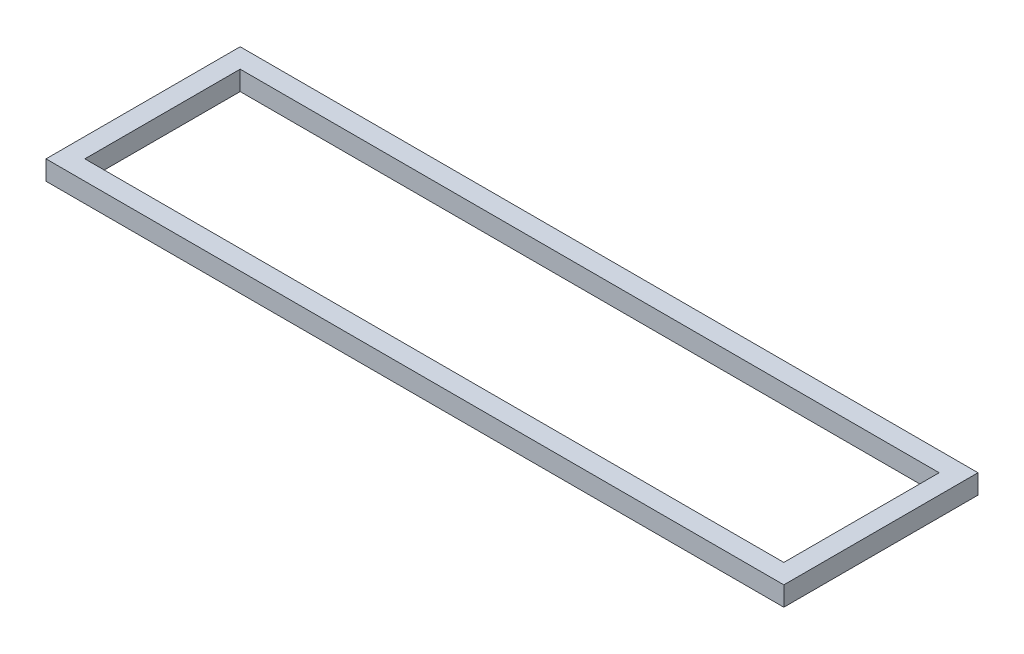
ISO-10303-21;
HEADER;
FILE_DESCRIPTION(('STEP AP214'),'2;1');
FILE_NAME('part.step','',(''),(''),'','','');
FILE_SCHEMA(('AUTOMOTIVE_DESIGN { 1 0 10303 214 1 1 1 1 }'));
ENDSEC;
DATA;
#1=APPLICATION_CONTEXT('core data for automotive mechanical design processes');
#2=APPLICATION_PROTOCOL_DEFINITION('international standard','automotive_design',2000,#1);
#3=PRODUCT_CONTEXT('',#1,'mechanical');
#4=PRODUCT('Part','Part','',(#3));
#5=PRODUCT_RELATED_PRODUCT_CATEGORY('part','',(#4));
#6=PRODUCT_DEFINITION_FORMATION('','',#4);
#7=PRODUCT_DEFINITION_CONTEXT('part definition',#1,'design');
#8=PRODUCT_DEFINITION('design','',#6,#7);
#9=PRODUCT_DEFINITION_SHAPE('','',#8);
#10=(LENGTH_UNIT() NAMED_UNIT(*) SI_UNIT(.MILLI.,.METRE.));
#11=(NAMED_UNIT(*) PLANE_ANGLE_UNIT() SI_UNIT($,.RADIAN.));
#12=(NAMED_UNIT(*) SI_UNIT($,.STERADIAN.) SOLID_ANGLE_UNIT());
#13=UNCERTAINTY_MEASURE_WITH_UNIT(LENGTH_MEASURE(1.E-05),#10,'distance_accuracy_value','');
#14=(GEOMETRIC_REPRESENTATION_CONTEXT(3) GLOBAL_UNCERTAINTY_ASSIGNED_CONTEXT((#13)) GLOBAL_UNIT_ASSIGNED_CONTEXT((#10,
#11,#12)) REPRESENTATION_CONTEXT('',''));
#15=CARTESIAN_POINT('',(0.,0.,0.));
#16=DIRECTION('',(0.,0.,1.));
#17=DIRECTION('',(1.,0.,0.));
#18=AXIS2_PLACEMENT_3D('',#15,#16,#17);
#19=CARTESIAN_POINT('',(0.,3.175,0.));
#20=DIRECTION('',(1.,0.,0.));
#21=DIRECTION('',(0.,0.,-1.));
#22=AXIS2_PLACEMENT_3D('',#19,#20,#21);
#23=PLANE('',#22);
#24=DIRECTION('',(0.,0.,1.));
#25=VECTOR('',#24,1.);
#26=CARTESIAN_POINT('',(0.,0.,0.));
#27=LINE('',#26,#25);
#28=CARTESIAN_POINT('',(0.,0.,-31.75));
#29=VERTEX_POINT('',#28);
#30=CARTESIAN_POINT('',(0.,0.,0.));
#31=VERTEX_POINT('',#30);
#32=EDGE_CURVE('E122',#29,#31,#27,.T.);
#33=ORIENTED_EDGE('',*,*,#32,.T.);
#34=DIRECTION('',(0.,-1.,0.));
#35=VECTOR('',#34,1.);
#36=CARTESIAN_POINT('',(0.,3.175,0.));
#37=LINE('',#36,#35);
#38=CARTESIAN_POINT('',(0.,3.175,0.));
#39=VERTEX_POINT('',#38);
#40=EDGE_CURVE('E151',#39,#31,#37,.T.);
#41=ORIENTED_EDGE('',*,*,#40,.F.);
#42=DIRECTION('',(0.,0.,1.));
#43=VECTOR('',#42,1.);
#44=CARTESIAN_POINT('',(0.,3.175,0.));
#45=LINE('',#44,#43);
#46=CARTESIAN_POINT('',(0.,3.175,-31.75));
#47=VERTEX_POINT('',#46);
#48=EDGE_CURVE('E125',#47,#39,#45,.T.);
#49=ORIENTED_EDGE('',*,*,#48,.F.);
#50=DIRECTION('',(0.,-1.,0.));
#51=VECTOR('',#50,1.);
#52=CARTESIAN_POINT('',(0.,3.175,-31.75));
#53=LINE('',#52,#51);
#54=EDGE_CURVE('E135',#47,#29,#53,.T.);
#55=ORIENTED_EDGE('',*,*,#54,.T.);
#56=EDGE_LOOP('',(#33,#41,#49,#55));
#57=FACE_BOUND('',#56,.T.);
#58=ADVANCED_FACE('F33',(#57),#23,.F.);
#59=CARTESIAN_POINT('',(0.,3.175,0.));
#60=DIRECTION('',(0.,0.,-1.));
#61=DIRECTION('',(-1.,0.,0.));
#62=AXIS2_PLACEMENT_3D('',#59,#60,#61);
#63=PLANE('',#62);
#64=DIRECTION('',(1.,0.,0.));
#65=VECTOR('',#64,1.);
#66=CARTESIAN_POINT('',(0.,0.,0.));
#67=LINE('',#66,#65);
#68=CARTESIAN_POINT('',(120.65,0.,0.));
#69=VERTEX_POINT('',#68);
#70=EDGE_CURVE('E138',#31,#69,#67,.T.);
#71=ORIENTED_EDGE('',*,*,#70,.T.);
#72=DIRECTION('',(0.,-1.,0.));
#73=VECTOR('',#72,1.);
#74=CARTESIAN_POINT('',(120.65,3.175,0.));
#75=LINE('',#74,#73);
#76=CARTESIAN_POINT('',(120.65,3.175,0.));
#77=VERTEX_POINT('',#76);
#78=EDGE_CURVE('E148',#77,#69,#75,.T.);
#79=ORIENTED_EDGE('',*,*,#78,.F.);
#80=DIRECTION('',(1.,0.,0.));
#81=VECTOR('',#80,1.);
#82=CARTESIAN_POINT('',(0.,3.175,0.));
#83=LINE('',#82,#81);
#84=EDGE_CURVE('E128',#39,#77,#83,.T.);
#85=ORIENTED_EDGE('',*,*,#84,.F.);
#86=ORIENTED_EDGE('',*,*,#40,.T.);
#87=EDGE_LOOP('',(#71,#79,#85,#86));
#88=FACE_BOUND('',#87,.T.);
#89=ADVANCED_FACE('F176',(#88),#63,.F.);
#90=CARTESIAN_POINT('',(120.65,3.175,0.));
#91=DIRECTION('',(-1.,0.,0.));
#92=DIRECTION('',(0.,0.,1.));
#93=AXIS2_PLACEMENT_3D('',#90,#91,#92);
#94=PLANE('',#93);
#95=DIRECTION('',(0.,0.,-1.));
#96=VECTOR('',#95,1.);
#97=CARTESIAN_POINT('',(120.65,0.,0.));
#98=LINE('',#97,#96);
#99=CARTESIAN_POINT('',(120.65,0.,-31.75));
#100=VERTEX_POINT('',#99);
#101=EDGE_CURVE('E140',#69,#100,#98,.T.);
#102=ORIENTED_EDGE('',*,*,#101,.T.);
#103=DIRECTION('',(0.,-1.,0.));
#104=VECTOR('',#103,1.);
#105=CARTESIAN_POINT('',(120.65,3.175,-31.75));
#106=LINE('',#105,#104);
#107=CARTESIAN_POINT('',(120.65,3.175,-31.75));
#108=VERTEX_POINT('',#107);
#109=EDGE_CURVE('E145',#108,#100,#106,.T.);
#110=ORIENTED_EDGE('',*,*,#109,.F.);
#111=DIRECTION('',(0.,0.,-1.));
#112=VECTOR('',#111,1.);
#113=CARTESIAN_POINT('',(120.65,3.175,0.));
#114=LINE('',#113,#112);
#115=EDGE_CURVE('E131',#77,#108,#114,.T.);
#116=ORIENTED_EDGE('',*,*,#115,.F.);
#117=ORIENTED_EDGE('',*,*,#78,.T.);
#118=EDGE_LOOP('',(#102,#110,#116,#117));
#119=FACE_BOUND('',#118,.T.);
#120=ADVANCED_FACE('F181',(#119),#94,.F.);
#121=CARTESIAN_POINT('',(0.,3.175,-31.75));
#122=DIRECTION('',(0.,0.,1.));
#123=DIRECTION('',(1.,0.,0.));
#124=AXIS2_PLACEMENT_3D('',#121,#122,#123);
#125=PLANE('',#124);
#126=DIRECTION('',(-1.,0.,0.));
#127=VECTOR('',#126,1.);
#128=CARTESIAN_POINT('',(0.,0.,-31.75));
#129=LINE('',#128,#127);
#130=EDGE_CURVE('E129',#100,#29,#129,.T.);
#131=ORIENTED_EDGE('',*,*,#130,.T.);
#132=ORIENTED_EDGE('',*,*,#54,.F.);
#133=DIRECTION('',(-1.,0.,0.));
#134=VECTOR('',#133,1.);
#135=CARTESIAN_POINT('',(0.,3.175,-31.75));
#136=LINE('',#135,#134);
#137=EDGE_CURVE('E133',#108,#47,#136,.T.);
#138=ORIENTED_EDGE('',*,*,#137,.F.);
#139=ORIENTED_EDGE('',*,*,#109,.T.);
#140=EDGE_LOOP('',(#131,#132,#138,#139));
#141=FACE_BOUND('',#140,.T.);
#142=ADVANCED_FACE('F194',(#141),#125,.F.);
#143=CARTESIAN_POINT('',(0.,3.175,0.));
#144=DIRECTION('',(0.,-1.,0.));
#145=DIRECTION('',(0.,0.,-1.));
#146=AXIS2_PLACEMENT_3D('',#143,#144,#145);
#147=PLANE('',#146);
#148=DIRECTION('',(1.,0.,0.));
#149=VECTOR('',#148,1.);
#150=CARTESIAN_POINT('',(3.175,3.175,-3.175));
#151=LINE('',#150,#149);
#152=CARTESIAN_POINT('',(3.175,3.175,-3.175));
#153=VERTEX_POINT('',#152);
#154=CARTESIAN_POINT('',(117.475,3.175,-3.175));
#155=VERTEX_POINT('',#154);
#156=EDGE_CURVE('E108',#153,#155,#151,.T.);
#157=ORIENTED_EDGE('',*,*,#156,.F.);
#158=DIRECTION('',(0.,0.,1.));
#159=VECTOR('',#158,1.);
#160=CARTESIAN_POINT('',(3.175,3.175,-28.575));
#161=LINE('',#160,#159);
#162=CARTESIAN_POINT('',(3.175,3.175,-28.575));
#163=VERTEX_POINT('',#162);
#164=EDGE_CURVE('E47',#163,#153,#161,.T.);
#165=ORIENTED_EDGE('',*,*,#164,.F.);
#166=DIRECTION('',(-1.,0.,0.));
#167=VECTOR('',#166,1.);
#168=CARTESIAN_POINT('',(3.175,3.175,-28.575));
#169=LINE('',#168,#167);
#170=CARTESIAN_POINT('',(117.475,3.175,-28.575));
#171=VERTEX_POINT('',#170);
#172=EDGE_CURVE('E115',#171,#163,#169,.T.);
#173=ORIENTED_EDGE('',*,*,#172,.F.);
#174=DIRECTION('',(0.,0.,-1.));
#175=VECTOR('',#174,1.);
#176=CARTESIAN_POINT('',(117.475,3.175,-28.575));
#177=LINE('',#176,#175);
#178=EDGE_CURVE('E99',#155,#171,#177,.T.);
#179=ORIENTED_EDGE('',*,*,#178,.F.);
#180=EDGE_LOOP('',(#157,#165,#173,#179));
#181=FACE_BOUND('',#180,.T.);
#182=ORIENTED_EDGE('',*,*,#48,.T.);
#183=ORIENTED_EDGE('',*,*,#84,.T.);
#184=ORIENTED_EDGE('',*,*,#115,.T.);
#185=ORIENTED_EDGE('',*,*,#137,.T.);
#186=EDGE_LOOP('',(#182,#183,#184,#185));
#187=FACE_BOUND('',#186,.T.);
#188=ADVANCED_FACE('F112',(#181,#187),#147,.F.);
#189=CARTESIAN_POINT('',(0.,0.,0.));
#190=DIRECTION('',(0.,-1.,0.));
#191=DIRECTION('',(0.,0.,-1.));
#192=AXIS2_PLACEMENT_3D('',#189,#190,#191);
#193=PLANE('',#192);
#194=DIRECTION('',(0.,0.,-1.));
#195=VECTOR('',#194,1.);
#196=CARTESIAN_POINT('',(3.175,0.,0.));
#197=LINE('',#196,#195);
#198=CARTESIAN_POINT('',(3.175,0.,-3.175));
#199=VERTEX_POINT('',#198);
#200=CARTESIAN_POINT('',(3.175,0.,-28.575));
#201=VERTEX_POINT('',#200);
#202=EDGE_CURVE('E11',#199,#201,#197,.T.);
#203=ORIENTED_EDGE('',*,*,#202,.F.);
#204=DIRECTION('',(-1.,0.,0.));
#205=VECTOR('',#204,1.);
#206=CARTESIAN_POINT('',(0.,0.,-3.175));
#207=LINE('',#206,#205);
#208=CARTESIAN_POINT('',(117.475,0.,-3.175));
#209=VERTEX_POINT('',#208);
#210=EDGE_CURVE('E154',#209,#199,#207,.T.);
#211=ORIENTED_EDGE('',*,*,#210,.F.);
#212=DIRECTION('',(0.,0.,1.));
#213=VECTOR('',#212,1.);
#214=CARTESIAN_POINT('',(117.475,0.,0.));
#215=LINE('',#214,#213);
#216=CARTESIAN_POINT('',(117.475,0.,-28.575));
#217=VERTEX_POINT('',#216);
#218=EDGE_CURVE('E102',#217,#209,#215,.T.);
#219=ORIENTED_EDGE('',*,*,#218,.F.);
#220=DIRECTION('',(1.,0.,0.));
#221=VECTOR('',#220,1.);
#222=CARTESIAN_POINT('',(0.,0.,-28.575));
#223=LINE('',#222,#221);
#224=EDGE_CURVE('E40',#201,#217,#223,.T.);
#225=ORIENTED_EDGE('',*,*,#224,.F.);
#226=EDGE_LOOP('',(#203,#211,#219,#225));
#227=FACE_BOUND('',#226,.T.);
#228=ORIENTED_EDGE('',*,*,#32,.F.);
#229=ORIENTED_EDGE('',*,*,#130,.F.);
#230=ORIENTED_EDGE('',*,*,#101,.F.);
#231=ORIENTED_EDGE('',*,*,#70,.F.);
#232=EDGE_LOOP('',(#228,#229,#230,#231));
#233=FACE_BOUND('',#232,.T.);
#234=ADVANCED_FACE('F162',(#227,#233),#193,.T.);
#235=CARTESIAN_POINT('',(3.175,-1.905,-28.575));
#236=DIRECTION('',(-1.,0.,0.));
#237=DIRECTION('',(0.,0.,1.));
#238=AXIS2_PLACEMENT_3D('',#235,#236,#237);
#239=PLANE('',#238);
#240=ORIENTED_EDGE('',*,*,#202,.T.);
#241=DIRECTION('',(0.,1.,0.));
#242=VECTOR('',#241,1.);
#243=CARTESIAN_POINT('',(3.175,-1.905,-28.575));
#244=LINE('',#243,#242);
#245=EDGE_CURVE('E120',#201,#163,#244,.T.);
#246=ORIENTED_EDGE('',*,*,#245,.T.);
#247=ORIENTED_EDGE('',*,*,#164,.T.);
#248=DIRECTION('',(0.,1.,0.));
#249=VECTOR('',#248,1.);
#250=CARTESIAN_POINT('',(3.175,-1.905,-3.175));
#251=LINE('',#250,#249);
#252=EDGE_CURVE('E105',#199,#153,#251,.T.);
#253=ORIENTED_EDGE('',*,*,#252,.F.);
#254=EDGE_LOOP('',(#240,#246,#247,#253));
#255=FACE_BOUND('',#254,.T.);
#256=ADVANCED_FACE('F164',(#255),#239,.F.);
#257=CARTESIAN_POINT('',(3.175,-1.905,-28.575));
#258=DIRECTION('',(0.,0.,-1.));
#259=DIRECTION('',(-1.,0.,0.));
#260=AXIS2_PLACEMENT_3D('',#257,#258,#259);
#261=PLANE('',#260);
#262=ORIENTED_EDGE('',*,*,#224,.T.);
#263=DIRECTION('',(0.,1.,0.));
#264=VECTOR('',#263,1.);
#265=CARTESIAN_POINT('',(117.475,-1.905,-28.575));
#266=LINE('',#265,#264);
#267=EDGE_CURVE('E104',#217,#171,#266,.T.);
#268=ORIENTED_EDGE('',*,*,#267,.T.);
#269=ORIENTED_EDGE('',*,*,#172,.T.);
#270=ORIENTED_EDGE('',*,*,#245,.F.);
#271=EDGE_LOOP('',(#262,#268,#269,#270));
#272=FACE_BOUND('',#271,.T.);
#273=ADVANCED_FACE('F159',(#272),#261,.F.);
#274=CARTESIAN_POINT('',(117.475,-1.905,-28.575));
#275=DIRECTION('',(1.,0.,0.));
#276=DIRECTION('',(0.,0.,-1.));
#277=AXIS2_PLACEMENT_3D('',#274,#275,#276);
#278=PLANE('',#277);
#279=ORIENTED_EDGE('',*,*,#218,.T.);
#280=DIRECTION('',(0.,1.,0.));
#281=VECTOR('',#280,1.);
#282=CARTESIAN_POINT('',(117.475,-1.905,-3.175));
#283=LINE('',#282,#281);
#284=EDGE_CURVE('E55',#209,#155,#283,.T.);
#285=ORIENTED_EDGE('',*,*,#284,.T.);
#286=ORIENTED_EDGE('',*,*,#178,.T.);
#287=ORIENTED_EDGE('',*,*,#267,.F.);
#288=EDGE_LOOP('',(#279,#285,#286,#287));
#289=FACE_BOUND('',#288,.T.);
#290=ADVANCED_FACE('F96',(#289),#278,.F.);
#291=CARTESIAN_POINT('',(3.175,-1.905,-3.175));
#292=DIRECTION('',(0.,0.,1.));
#293=DIRECTION('',(1.,0.,0.));
#294=AXIS2_PLACEMENT_3D('',#291,#292,#293);
#295=PLANE('',#294);
#296=ORIENTED_EDGE('',*,*,#210,.T.);
#297=ORIENTED_EDGE('',*,*,#252,.T.);
#298=ORIENTED_EDGE('',*,*,#156,.T.);
#299=ORIENTED_EDGE('',*,*,#284,.F.);
#300=EDGE_LOOP('',(#296,#297,#298,#299));
#301=FACE_BOUND('',#300,.T.);
#302=ADVANCED_FACE('F109',(#301),#295,.F.);
#303=CLOSED_SHELL('',(#58,#89,#120,#142,#188,#234,#256,#273,#290,#302));
#304=MANIFOLD_SOLID_BREP('B2',#303);
#305=ADVANCED_BREP_SHAPE_REPRESENTATION('',(#18,#304),#14);
#306=SHAPE_DEFINITION_REPRESENTATION(#9,#305);
ENDSEC;
END-ISO-10303-21;
